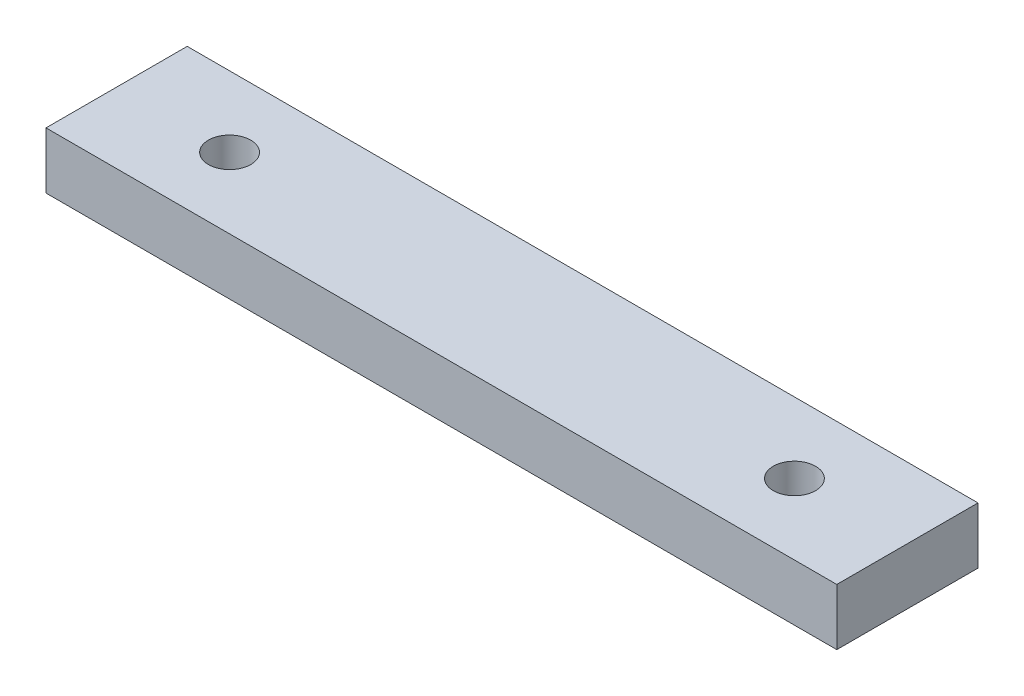
ISO-10303-21;
HEADER;
FILE_DESCRIPTION(('STEP AP214'),'2;1');
FILE_NAME('part.step','',(''),(''),'','','');
FILE_SCHEMA(('AUTOMOTIVE_DESIGN { 1 0 10303 214 1 1 1 1 }'));
ENDSEC;
DATA;
#1=APPLICATION_CONTEXT('core data for automotive mechanical design processes');
#2=APPLICATION_PROTOCOL_DEFINITION('international standard','automotive_design',2000,#1);
#3=PRODUCT_CONTEXT('',#1,'mechanical');
#4=PRODUCT('Part','Part','',(#3));
#5=PRODUCT_RELATED_PRODUCT_CATEGORY('part','',(#4));
#6=PRODUCT_DEFINITION_FORMATION('','',#4);
#7=PRODUCT_DEFINITION_CONTEXT('part definition',#1,'design');
#8=PRODUCT_DEFINITION('design','',#6,#7);
#9=PRODUCT_DEFINITION_SHAPE('','',#8);
#10=(LENGTH_UNIT() NAMED_UNIT(*) SI_UNIT(.MILLI.,.METRE.));
#11=(NAMED_UNIT(*) PLANE_ANGLE_UNIT() SI_UNIT($,.RADIAN.));
#12=(NAMED_UNIT(*) SI_UNIT($,.STERADIAN.) SOLID_ANGLE_UNIT());
#13=UNCERTAINTY_MEASURE_WITH_UNIT(LENGTH_MEASURE(1.E-05),#10,'distance_accuracy_value','');
#14=(GEOMETRIC_REPRESENTATION_CONTEXT(3) GLOBAL_UNCERTAINTY_ASSIGNED_CONTEXT((#13)) GLOBAL_UNIT_ASSIGNED_CONTEXT((#10,
#11,#12)) REPRESENTATION_CONTEXT('',''));
#15=CARTESIAN_POINT('',(0.,0.,0.));
#16=DIRECTION('',(0.,0.,1.));
#17=DIRECTION('',(1.,0.,0.));
#18=AXIS2_PLACEMENT_3D('',#15,#16,#17);
#19=CARTESIAN_POINT('',(0.,4.,8.91054793238082));
#20=DIRECTION('',(0.,0.,1.));
#21=DIRECTION('',(1.,0.,0.));
#22=AXIS2_PLACEMENT_3D('',#19,#20,#21);
#23=PLANE('',#22);
#24=DIRECTION('',(-1.,0.,0.));
#25=VECTOR('',#24,1.);
#26=CARTESIAN_POINT('',(0.,0.,8.91054793238082));
#27=LINE('',#26,#25);
#28=CARTESIAN_POINT('',(28.,0.,8.91054793238082));
#29=VERTEX_POINT('',#28);
#30=CARTESIAN_POINT('',(-28.,0.,8.91054793238082));
#31=VERTEX_POINT('',#30);
#32=EDGE_CURVE('E109',#29,#31,#27,.T.);
#33=ORIENTED_EDGE('',*,*,#32,.F.);
#34=DIRECTION('',(0.,-1.,0.));
#35=VECTOR('',#34,1.);
#36=CARTESIAN_POINT('',(28.,4.,8.91054793238082));
#37=LINE('',#36,#35);
#38=CARTESIAN_POINT('',(28.,4.,8.91054793238082));
#39=VERTEX_POINT('',#38);
#40=EDGE_CURVE('E11',#39,#29,#37,.T.);
#41=ORIENTED_EDGE('',*,*,#40,.F.);
#42=DIRECTION('',(-1.,0.,0.));
#43=VECTOR('',#42,1.);
#44=CARTESIAN_POINT('',(0.,4.,8.91054793238082));
#45=LINE('',#44,#43);
#46=CARTESIAN_POINT('',(-28.,4.,8.91054793238082));
#47=VERTEX_POINT('',#46);
#48=EDGE_CURVE('E88',#39,#47,#45,.T.);
#49=ORIENTED_EDGE('',*,*,#48,.T.);
#50=DIRECTION('',(0.,-1.,0.));
#51=VECTOR('',#50,1.);
#52=CARTESIAN_POINT('',(-28.,4.,8.91054793238082));
#53=LINE('',#52,#51);
#54=EDGE_CURVE('E56',#47,#31,#53,.T.);
#55=ORIENTED_EDGE('',*,*,#54,.T.);
#56=EDGE_LOOP('',(#33,#41,#49,#55));
#57=FACE_BOUND('',#56,.T.);
#58=ADVANCED_FACE('F39',(#57),#23,.T.);
#59=CARTESIAN_POINT('',(28.,4.,0.));
#60=DIRECTION('',(-1.,0.,0.));
#61=DIRECTION('',(0.,0.,1.));
#62=AXIS2_PLACEMENT_3D('',#59,#60,#61);
#63=PLANE('',#62);
#64=DIRECTION('',(0.,0.,-1.));
#65=VECTOR('',#64,1.);
#66=CARTESIAN_POINT('',(28.,0.,0.));
#67=LINE('',#66,#65);
#68=CARTESIAN_POINT('',(28.,0.,-1.08945206761918));
#69=VERTEX_POINT('',#68);
#70=EDGE_CURVE('E94',#29,#69,#67,.T.);
#71=ORIENTED_EDGE('',*,*,#70,.T.);
#72=DIRECTION('',(0.,-1.,0.));
#73=VECTOR('',#72,1.);
#74=CARTESIAN_POINT('',(28.,4.,-1.08945206761918));
#75=LINE('',#74,#73);
#76=CARTESIAN_POINT('',(28.,4.,-1.08945206761918));
#77=VERTEX_POINT('',#76);
#78=EDGE_CURVE('E48',#77,#69,#75,.T.);
#79=ORIENTED_EDGE('',*,*,#78,.F.);
#80=DIRECTION('',(0.,0.,-1.));
#81=VECTOR('',#80,1.);
#82=CARTESIAN_POINT('',(28.,4.,0.));
#83=LINE('',#82,#81);
#84=EDGE_CURVE('E82',#39,#77,#83,.T.);
#85=ORIENTED_EDGE('',*,*,#84,.F.);
#86=ORIENTED_EDGE('',*,*,#40,.T.);
#87=EDGE_LOOP('',(#71,#79,#85,#86));
#88=FACE_BOUND('',#87,.T.);
#89=ADVANCED_FACE('F92',(#88),#63,.F.);
#90=CARTESIAN_POINT('',(0.,4.,-1.08945206761918));
#91=DIRECTION('',(0.,0.,-1.));
#92=DIRECTION('',(-1.,0.,0.));
#93=AXIS2_PLACEMENT_3D('',#90,#91,#92);
#94=PLANE('',#93);
#95=DIRECTION('',(1.,0.,0.));
#96=VECTOR('',#95,1.);
#97=CARTESIAN_POINT('',(0.,0.,-1.08945206761918));
#98=LINE('',#97,#96);
#99=CARTESIAN_POINT('',(-28.,0.,-1.08945206761918));
#100=VERTEX_POINT('',#99);
#101=EDGE_CURVE('E112',#100,#69,#98,.T.);
#102=ORIENTED_EDGE('',*,*,#101,.F.);
#103=DIRECTION('',(0.,-1.,0.));
#104=VECTOR('',#103,1.);
#105=CARTESIAN_POINT('',(-28.,4.,-1.08945206761918));
#106=LINE('',#105,#104);
#107=CARTESIAN_POINT('',(-28.,4.,-1.08945206761918));
#108=VERTEX_POINT('',#107);
#109=EDGE_CURVE('E69',#108,#100,#106,.T.);
#110=ORIENTED_EDGE('',*,*,#109,.F.);
#111=DIRECTION('',(1.,0.,0.));
#112=VECTOR('',#111,1.);
#113=CARTESIAN_POINT('',(0.,4.,-1.08945206761918));
#114=LINE('',#113,#112);
#115=EDGE_CURVE('E87',#108,#77,#114,.T.);
#116=ORIENTED_EDGE('',*,*,#115,.T.);
#117=ORIENTED_EDGE('',*,*,#78,.T.);
#118=EDGE_LOOP('',(#102,#110,#116,#117));
#119=FACE_BOUND('',#118,.T.);
#120=ADVANCED_FACE('F97',(#119),#94,.T.);
#121=CARTESIAN_POINT('',(-20.,4.,3.91054793238082));
#122=DIRECTION('',(0.,-1.,0.));
#123=DIRECTION('',(0.,0.,-1.));
#124=AXIS2_PLACEMENT_3D('',#121,#122,#123);
#125=CYLINDRICAL_SURFACE('',#124,1.5);
#126=CARTESIAN_POINT('',(-20.,4.,3.91054793238082));
#127=DIRECTION('',(0.,1.,0.));
#128=DIRECTION('',(0.,0.,1.));
#129=AXIS2_PLACEMENT_3D('',#126,#127,#128);
#130=CIRCLE('',#129,1.5);
#131=CARTESIAN_POINT('',(-20.,4.,5.41054793238082));
#132=VERTEX_POINT('',#131);
#133=EDGE_CURVE('E121',#132,#132,#130,.T.);
#134=ORIENTED_EDGE('',*,*,#133,.T.);
#135=EDGE_LOOP('',(#134));
#136=FACE_BOUND('',#135,.T.);
#137=CARTESIAN_POINT('',(-20.,0.,3.91054793238082));
#138=DIRECTION('',(0.,1.,0.));
#139=DIRECTION('',(0.,0.,1.));
#140=AXIS2_PLACEMENT_3D('',#137,#138,#139);
#141=CIRCLE('',#140,1.5);
#142=CARTESIAN_POINT('',(-20.,0.,5.41054793238082));
#143=VERTEX_POINT('',#142);
#144=EDGE_CURVE('E106',#143,#143,#141,.T.);
#145=ORIENTED_EDGE('',*,*,#144,.F.);
#146=EDGE_LOOP('',(#145));
#147=FACE_BOUND('',#146,.T.);
#148=ADVANCED_FACE('F137',(#136,#147),#125,.F.);
#149=CARTESIAN_POINT('',(20.,4.,3.91054793238082));
#150=DIRECTION('',(0.,-1.,0.));
#151=DIRECTION('',(0.,0.,-1.));
#152=AXIS2_PLACEMENT_3D('',#149,#150,#151);
#153=CYLINDRICAL_SURFACE('',#152,1.5);
#154=CARTESIAN_POINT('',(20.,4.,3.91054793238082));
#155=DIRECTION('',(0.,1.,0.));
#156=DIRECTION('',(0.,0.,1.));
#157=AXIS2_PLACEMENT_3D('',#154,#155,#156);
#158=CIRCLE('',#157,1.5);
#159=CARTESIAN_POINT('',(20.,4.,5.41054793238082));
#160=VERTEX_POINT('',#159);
#161=EDGE_CURVE('E117',#160,#160,#158,.T.);
#162=ORIENTED_EDGE('',*,*,#161,.T.);
#163=EDGE_LOOP('',(#162));
#164=FACE_BOUND('',#163,.T.);
#165=CARTESIAN_POINT('',(20.,0.,3.91054793238082));
#166=DIRECTION('',(0.,1.,0.));
#167=DIRECTION('',(0.,0.,1.));
#168=AXIS2_PLACEMENT_3D('',#165,#166,#167);
#169=CIRCLE('',#168,1.5);
#170=CARTESIAN_POINT('',(20.,0.,5.41054793238082));
#171=VERTEX_POINT('',#170);
#172=EDGE_CURVE('E103',#171,#171,#169,.T.);
#173=ORIENTED_EDGE('',*,*,#172,.F.);
#174=EDGE_LOOP('',(#173));
#175=FACE_BOUND('',#174,.T.);
#176=ADVANCED_FACE('F41',(#164,#175),#153,.F.);
#177=CARTESIAN_POINT('',(-28.,4.,0.));
#178=DIRECTION('',(-1.,0.,0.));
#179=DIRECTION('',(0.,0.,1.));
#180=AXIS2_PLACEMENT_3D('',#177,#178,#179);
#181=PLANE('',#180);
#182=DIRECTION('',(0.,0.,-1.));
#183=VECTOR('',#182,1.);
#184=CARTESIAN_POINT('',(-28.,0.,0.));
#185=LINE('',#184,#183);
#186=EDGE_CURVE('E114',#31,#100,#185,.T.);
#187=ORIENTED_EDGE('',*,*,#186,.F.);
#188=ORIENTED_EDGE('',*,*,#54,.F.);
#189=DIRECTION('',(0.,0.,-1.));
#190=VECTOR('',#189,1.);
#191=CARTESIAN_POINT('',(-28.,4.,0.));
#192=LINE('',#191,#190);
#193=EDGE_CURVE('E98',#47,#108,#192,.T.);
#194=ORIENTED_EDGE('',*,*,#193,.T.);
#195=ORIENTED_EDGE('',*,*,#109,.T.);
#196=EDGE_LOOP('',(#187,#188,#194,#195));
#197=FACE_BOUND('',#196,.T.);
#198=ADVANCED_FACE('F127',(#197),#181,.T.);
#199=CARTESIAN_POINT('',(0.,4.,0.));
#200=DIRECTION('',(0.,1.,0.));
#201=DIRECTION('',(0.,0.,1.));
#202=AXIS2_PLACEMENT_3D('',#199,#200,#201);
#203=PLANE('',#202);
#204=ORIENTED_EDGE('',*,*,#161,.F.);
#205=EDGE_LOOP('',(#204));
#206=FACE_BOUND('',#205,.T.);
#207=ORIENTED_EDGE('',*,*,#133,.F.);
#208=EDGE_LOOP('',(#207));
#209=FACE_BOUND('',#208,.T.);
#210=ORIENTED_EDGE('',*,*,#48,.F.);
#211=ORIENTED_EDGE('',*,*,#84,.T.);
#212=ORIENTED_EDGE('',*,*,#115,.F.);
#213=ORIENTED_EDGE('',*,*,#193,.F.);
#214=EDGE_LOOP('',(#210,#211,#212,#213));
#215=FACE_BOUND('',#214,.T.);
#216=ADVANCED_FACE('F84',(#206,#209,#215),#203,.T.);
#217=CARTESIAN_POINT('',(0.,0.,0.));
#218=DIRECTION('',(0.,1.,0.));
#219=DIRECTION('',(0.,0.,1.));
#220=AXIS2_PLACEMENT_3D('',#217,#218,#219);
#221=PLANE('',#220);
#222=ORIENTED_EDGE('',*,*,#172,.T.);
#223=EDGE_LOOP('',(#222));
#224=FACE_BOUND('',#223,.T.);
#225=ORIENTED_EDGE('',*,*,#144,.T.);
#226=EDGE_LOOP('',(#225));
#227=FACE_BOUND('',#226,.T.);
#228=ORIENTED_EDGE('',*,*,#32,.T.);
#229=ORIENTED_EDGE('',*,*,#186,.T.);
#230=ORIENTED_EDGE('',*,*,#101,.T.);
#231=ORIENTED_EDGE('',*,*,#70,.F.);
#232=EDGE_LOOP('',(#228,#229,#230,#231));
#233=FACE_BOUND('',#232,.T.);
#234=ADVANCED_FACE('F134',(#224,#227,#233),#221,.F.);
#235=CLOSED_SHELL('',(#58,#89,#120,#148,#176,#198,#216,#234));
#236=MANIFOLD_SOLID_BREP('B2',#235);
#237=ADVANCED_BREP_SHAPE_REPRESENTATION('',(#18,#236),#14);
#238=SHAPE_DEFINITION_REPRESENTATION(#9,#237);
ENDSEC;
END-ISO-10303-21;
